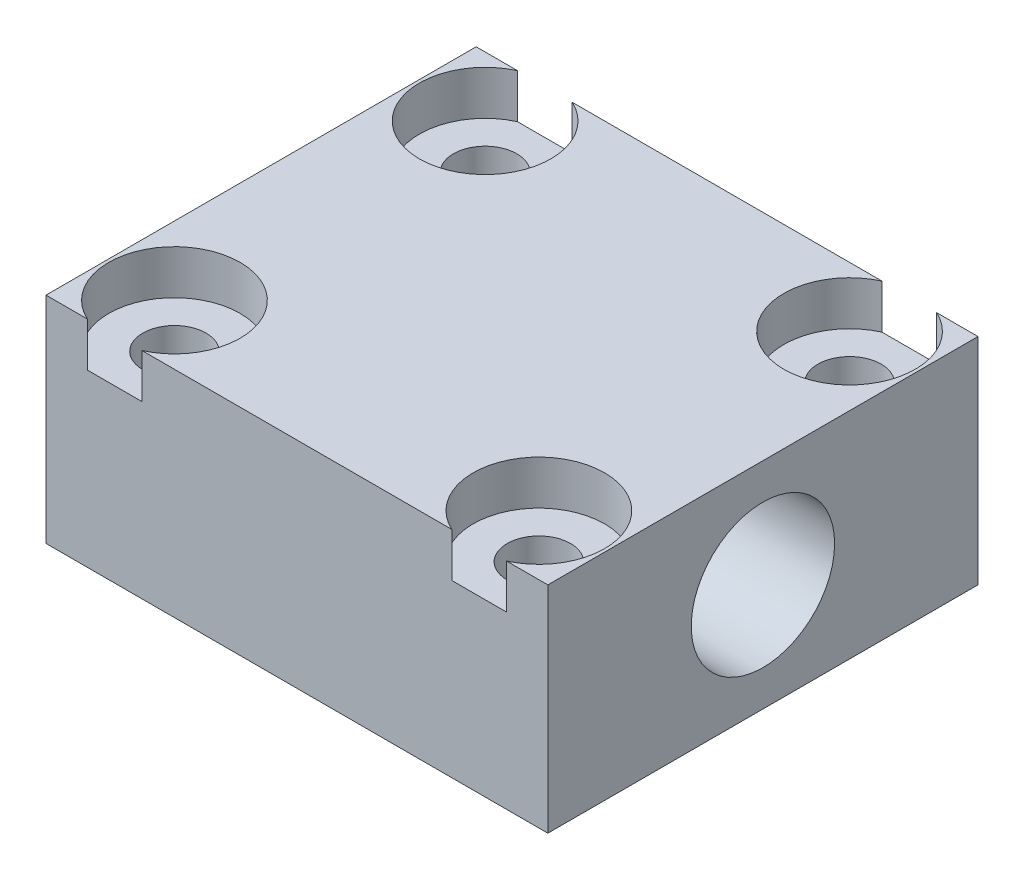
ISO-10303-21;
HEADER;
FILE_DESCRIPTION(('STEP AP214'),'2;1');
FILE_NAME('part.step','',(''),(''),'','','');
FILE_SCHEMA(('AUTOMOTIVE_DESIGN { 1 0 10303 214 1 1 1 1 }'));
ENDSEC;
DATA;
#1=APPLICATION_CONTEXT('core data for automotive mechanical design processes');
#2=APPLICATION_PROTOCOL_DEFINITION('international standard','automotive_design',2000,#1);
#3=PRODUCT_CONTEXT('',#1,'mechanical');
#4=PRODUCT('Part','Part','',(#3));
#5=PRODUCT_RELATED_PRODUCT_CATEGORY('part','',(#4));
#6=PRODUCT_DEFINITION_FORMATION('','',#4);
#7=PRODUCT_DEFINITION_CONTEXT('part definition',#1,'design');
#8=PRODUCT_DEFINITION('design','',#6,#7);
#9=PRODUCT_DEFINITION_SHAPE('','',#8);
#10=(LENGTH_UNIT() NAMED_UNIT(*) SI_UNIT(.MILLI.,.METRE.));
#11=(NAMED_UNIT(*) PLANE_ANGLE_UNIT() SI_UNIT($,.RADIAN.));
#12=(NAMED_UNIT(*) SI_UNIT($,.STERADIAN.) SOLID_ANGLE_UNIT());
#13=UNCERTAINTY_MEASURE_WITH_UNIT(LENGTH_MEASURE(1.E-05),#10,'distance_accuracy_value','');
#14=(GEOMETRIC_REPRESENTATION_CONTEXT(3) GLOBAL_UNCERTAINTY_ASSIGNED_CONTEXT((#13)) GLOBAL_UNIT_ASSIGNED_CONTEXT((#10,
#11,#12)) REPRESENTATION_CONTEXT('',''));
#15=CARTESIAN_POINT('',(0.,0.,0.));
#16=DIRECTION('',(0.,0.,1.));
#17=DIRECTION('',(1.,0.,0.));
#18=AXIS2_PLACEMENT_3D('',#15,#16,#17);
#19=CARTESIAN_POINT('',(21.,18.,-18.));
#20=DIRECTION('',(-1.,0.,0.));
#21=DIRECTION('',(0.,0.,1.));
#22=AXIS2_PLACEMENT_3D('',#19,#20,#21);
#23=PLANE('',#22);
#24=CARTESIAN_POINT('',(21.,9.,0.));
#25=DIRECTION('',(1.,0.,0.));
#26=DIRECTION('',(0.,0.,-1.));
#27=AXIS2_PLACEMENT_3D('',#24,#25,#26);
#28=CIRCLE('',#27,6.);
#29=CARTESIAN_POINT('',(21.,9.,-6.));
#30=VERTEX_POINT('',#29);
#31=EDGE_CURVE('E277',#30,#30,#28,.T.);
#32=ORIENTED_EDGE('',*,*,#31,.F.);
#33=EDGE_LOOP('',(#32));
#34=FACE_BOUND('',#33,.T.);
#35=DIRECTION('',(0.,0.,-1.));
#36=VECTOR('',#35,1.);
#37=CARTESIAN_POINT('',(21.,0.,-18.));
#38=LINE('',#37,#36);
#39=CARTESIAN_POINT('',(21.,0.,18.));
#40=VERTEX_POINT('',#39);
#41=CARTESIAN_POINT('',(21.,0.,-18.));
#42=VERTEX_POINT('',#41);
#43=EDGE_CURVE('E187',#40,#42,#38,.T.);
#44=ORIENTED_EDGE('',*,*,#43,.T.);
#45=DIRECTION('',(0.,-1.,0.));
#46=VECTOR('',#45,1.);
#47=CARTESIAN_POINT('',(21.,18.,-18.));
#48=LINE('',#47,#46);
#49=CARTESIAN_POINT('',(21.,18.,-18.));
#50=VERTEX_POINT('',#49);
#51=EDGE_CURVE('E219',#50,#42,#48,.T.);
#52=ORIENTED_EDGE('',*,*,#51,.F.);
#53=DIRECTION('',(0.,0.,-1.));
#54=VECTOR('',#53,1.);
#55=CARTESIAN_POINT('',(21.,18.,-18.));
#56=LINE('',#55,#54);
#57=CARTESIAN_POINT('',(21.,18.,18.));
#58=VERTEX_POINT('',#57);
#59=EDGE_CURVE('E188',#58,#50,#56,.T.);
#60=ORIENTED_EDGE('',*,*,#59,.F.);
#61=DIRECTION('',(0.,-1.,0.));
#62=VECTOR('',#61,1.);
#63=CARTESIAN_POINT('',(21.,18.,18.));
#64=LINE('',#63,#62);
#65=EDGE_CURVE('E203',#58,#40,#64,.T.);
#66=ORIENTED_EDGE('',*,*,#65,.T.);
#67=EDGE_LOOP('',(#44,#52,#60,#66));
#68=FACE_BOUND('',#67,.T.);
#69=ADVANCED_FACE('F33',(#34,#68),#23,.F.);
#70=CARTESIAN_POINT('',(-21.,18.,-18.));
#71=DIRECTION('',(0.,0.,1.));
#72=DIRECTION('',(1.,0.,0.));
#73=AXIS2_PLACEMENT_3D('',#70,#71,#72);
#74=PLANE('',#73);
#75=DIRECTION('',(1.,0.,0.));
#76=VECTOR('',#75,1.);
#77=CARTESIAN_POINT('',(-21.,14.3,-18.));
#78=LINE('',#77,#76);
#79=CARTESIAN_POINT('',(12.9587121525221,14.3,-18.));
#80=VERTEX_POINT('',#79);
#81=CARTESIAN_POINT('',(17.5412878474779,14.3,-18.));
#82=VERTEX_POINT('',#81);
#83=EDGE_CURVE('E230',#80,#82,#78,.T.);
#84=ORIENTED_EDGE('',*,*,#83,.T.);
#85=DIRECTION('',(0.,1.,0.));
#86=VECTOR('',#85,1.);
#87=CARTESIAN_POINT('',(17.5412878474779,18.,-18.));
#88=LINE('',#87,#86);
#89=CARTESIAN_POINT('',(17.5412878474779,18.,-18.));
#90=VERTEX_POINT('',#89);
#91=EDGE_CURVE('E169',#82,#90,#88,.T.);
#92=ORIENTED_EDGE('',*,*,#91,.T.);
#93=DIRECTION('',(-1.,0.,0.));
#94=VECTOR('',#93,1.);
#95=CARTESIAN_POINT('',(-21.,18.,-18.));
#96=LINE('',#95,#94);
#97=EDGE_CURVE('E193',#50,#90,#96,.T.);
#98=ORIENTED_EDGE('',*,*,#97,.F.);
#99=ORIENTED_EDGE('',*,*,#51,.T.);
#100=DIRECTION('',(-1.,0.,0.));
#101=VECTOR('',#100,1.);
#102=CARTESIAN_POINT('',(-21.,0.,-18.));
#103=LINE('',#102,#101);
#104=CARTESIAN_POINT('',(-21.,0.,-18.));
#105=VERTEX_POINT('',#104);
#106=EDGE_CURVE('E206',#42,#105,#103,.T.);
#107=ORIENTED_EDGE('',*,*,#106,.T.);
#108=DIRECTION('',(0.,-1.,0.));
#109=VECTOR('',#108,1.);
#110=CARTESIAN_POINT('',(-21.,18.,-18.));
#111=LINE('',#110,#109);
#112=CARTESIAN_POINT('',(-21.,18.,-18.));
#113=VERTEX_POINT('',#112);
#114=EDGE_CURVE('E216',#113,#105,#111,.T.);
#115=ORIENTED_EDGE('',*,*,#114,.F.);
#116=CARTESIAN_POINT('',(-17.5412878474779,18.,-18.));
#117=VERTEX_POINT('',#116);
#118=EDGE_CURVE('E191',#117,#113,#96,.T.);
#119=ORIENTED_EDGE('',*,*,#118,.F.);
#120=DIRECTION('',(0.,1.,0.));
#121=VECTOR('',#120,1.);
#122=CARTESIAN_POINT('',(-17.5412878474779,18.,-18.));
#123=LINE('',#122,#121);
#124=CARTESIAN_POINT('',(-17.5412878474779,14.3,-18.));
#125=VERTEX_POINT('',#124);
#126=EDGE_CURVE('E181',#117,#125,#123,.F.);
#127=ORIENTED_EDGE('',*,*,#126,.T.);
#128=DIRECTION('',(1.,0.,0.));
#129=VECTOR('',#128,1.);
#130=CARTESIAN_POINT('',(-21.,14.3,-18.));
#131=LINE('',#130,#129);
#132=CARTESIAN_POINT('',(-12.9587121525221,14.3,-18.));
#133=VERTEX_POINT('',#132);
#134=EDGE_CURVE('E225',#125,#133,#131,.T.);
#135=ORIENTED_EDGE('',*,*,#134,.T.);
#136=DIRECTION('',(0.,1.,0.));
#137=VECTOR('',#136,1.);
#138=CARTESIAN_POINT('',(-12.9587121525221,18.,-18.));
#139=LINE('',#138,#137);
#140=CARTESIAN_POINT('',(-12.9587121525221,18.,-18.));
#141=VERTEX_POINT('',#140);
#142=EDGE_CURVE('E184',#133,#141,#139,.T.);
#143=ORIENTED_EDGE('',*,*,#142,.T.);
#144=CARTESIAN_POINT('',(12.9587121525221,18.,-18.));
#145=VERTEX_POINT('',#144);
#146=EDGE_CURVE('E197',#145,#141,#96,.T.);
#147=ORIENTED_EDGE('',*,*,#146,.F.);
#148=DIRECTION('',(0.,1.,0.));
#149=VECTOR('',#148,1.);
#150=CARTESIAN_POINT('',(12.9587121525221,18.,-18.));
#151=LINE('',#150,#149);
#152=EDGE_CURVE('E166',#145,#80,#151,.F.);
#153=ORIENTED_EDGE('',*,*,#152,.T.);
#154=EDGE_LOOP('',(#84,#92,#98,#99,#107,#115,#119,#127,#135,#143,#147,#153));
#155=FACE_BOUND('',#154,.T.);
#156=ADVANCED_FACE('F248',(#155),#74,.F.);
#157=CARTESIAN_POINT('',(-21.,18.,-18.));
#158=DIRECTION('',(1.,0.,0.));
#159=DIRECTION('',(0.,0.,-1.));
#160=AXIS2_PLACEMENT_3D('',#157,#158,#159);
#161=PLANE('',#160);
#162=CARTESIAN_POINT('',(-21.,9.,0.));
#163=DIRECTION('',(1.,0.,0.));
#164=DIRECTION('',(0.,0.,-1.));
#165=AXIS2_PLACEMENT_3D('',#162,#163,#164);
#166=CIRCLE('',#165,6.);
#167=CARTESIAN_POINT('',(-21.,9.,-6.));
#168=VERTEX_POINT('',#167);
#169=EDGE_CURVE('E279',#168,#168,#166,.T.);
#170=ORIENTED_EDGE('',*,*,#169,.T.);
#171=EDGE_LOOP('',(#170));
#172=FACE_BOUND('',#171,.T.);
#173=DIRECTION('',(0.,0.,1.));
#174=VECTOR('',#173,1.);
#175=CARTESIAN_POINT('',(-21.,0.,-18.));
#176=LINE('',#175,#174);
#177=CARTESIAN_POINT('',(-21.,0.,18.));
#178=VERTEX_POINT('',#177);
#179=EDGE_CURVE('E208',#105,#178,#176,.T.);
#180=ORIENTED_EDGE('',*,*,#179,.T.);
#181=DIRECTION('',(0.,-1.,0.));
#182=VECTOR('',#181,1.);
#183=CARTESIAN_POINT('',(-21.,18.,18.));
#184=LINE('',#183,#182);
#185=CARTESIAN_POINT('',(-21.,18.,18.));
#186=VERTEX_POINT('',#185);
#187=EDGE_CURVE('E213',#186,#178,#184,.T.);
#188=ORIENTED_EDGE('',*,*,#187,.F.);
#189=DIRECTION('',(0.,0.,1.));
#190=VECTOR('',#189,1.);
#191=CARTESIAN_POINT('',(-21.,18.,-18.));
#192=LINE('',#191,#190);
#193=EDGE_CURVE('E196',#113,#186,#192,.T.);
#194=ORIENTED_EDGE('',*,*,#193,.F.);
#195=ORIENTED_EDGE('',*,*,#114,.T.);
#196=EDGE_LOOP('',(#180,#188,#194,#195));
#197=FACE_BOUND('',#196,.T.);
#198=ADVANCED_FACE('F274',(#172,#197),#161,.F.);
#199=CARTESIAN_POINT('',(-21.,18.,18.));
#200=DIRECTION('',(0.,0.,-1.));
#201=DIRECTION('',(-1.,0.,0.));
#202=AXIS2_PLACEMENT_3D('',#199,#200,#201);
#203=PLANE('',#202);
#204=DIRECTION('',(-1.,0.,0.));
#205=VECTOR('',#204,1.);
#206=CARTESIAN_POINT('',(-21.,14.3,18.));
#207=LINE('',#206,#205);
#208=CARTESIAN_POINT('',(-12.9587121525221,14.3,18.));
#209=VERTEX_POINT('',#208);
#210=CARTESIAN_POINT('',(-17.5412878474779,14.3,18.));
#211=VERTEX_POINT('',#210);
#212=EDGE_CURVE('E11',#209,#211,#207,.T.);
#213=ORIENTED_EDGE('',*,*,#212,.T.);
#214=DIRECTION('',(0.,1.,0.));
#215=VECTOR('',#214,1.);
#216=CARTESIAN_POINT('',(-17.5412878474779,18.,18.));
#217=LINE('',#216,#215);
#218=CARTESIAN_POINT('',(-17.5412878474779,18.,18.));
#219=VERTEX_POINT('',#218);
#220=EDGE_CURVE('E128',#211,#219,#217,.T.);
#221=ORIENTED_EDGE('',*,*,#220,.T.);
#222=DIRECTION('',(1.,0.,0.));
#223=VECTOR('',#222,1.);
#224=CARTESIAN_POINT('',(-21.,18.,18.));
#225=LINE('',#224,#223);
#226=EDGE_CURVE('E200',#186,#219,#225,.T.);
#227=ORIENTED_EDGE('',*,*,#226,.F.);
#228=ORIENTED_EDGE('',*,*,#187,.T.);
#229=DIRECTION('',(1.,0.,0.));
#230=VECTOR('',#229,1.);
#231=CARTESIAN_POINT('',(-21.,0.,18.));
#232=LINE('',#231,#230);
#233=EDGE_CURVE('E192',#178,#40,#232,.T.);
#234=ORIENTED_EDGE('',*,*,#233,.T.);
#235=ORIENTED_EDGE('',*,*,#65,.F.);
#236=CARTESIAN_POINT('',(17.5412878474779,18.,18.));
#237=VERTEX_POINT('',#236);
#238=EDGE_CURVE('E199',#237,#58,#225,.T.);
#239=ORIENTED_EDGE('',*,*,#238,.F.);
#240=DIRECTION('',(0.,1.,0.));
#241=VECTOR('',#240,1.);
#242=CARTESIAN_POINT('',(17.5412878474779,18.,18.));
#243=LINE('',#242,#241);
#244=CARTESIAN_POINT('',(17.5412878474779,14.3,18.));
#245=VERTEX_POINT('',#244);
#246=EDGE_CURVE('E55',#237,#245,#243,.F.);
#247=ORIENTED_EDGE('',*,*,#246,.T.);
#248=DIRECTION('',(-1.,0.,0.));
#249=VECTOR('',#248,1.);
#250=CARTESIAN_POINT('',(-21.,14.3,18.));
#251=LINE('',#250,#249);
#252=CARTESIAN_POINT('',(12.9587121525221,14.3,18.));
#253=VERTEX_POINT('',#252);
#254=EDGE_CURVE('E40',#245,#253,#251,.T.);
#255=ORIENTED_EDGE('',*,*,#254,.T.);
#256=DIRECTION('',(0.,1.,0.));
#257=VECTOR('',#256,1.);
#258=CARTESIAN_POINT('',(12.9587121525221,18.,18.));
#259=LINE('',#258,#257);
#260=CARTESIAN_POINT('',(12.9587121525221,18.,18.));
#261=VERTEX_POINT('',#260);
#262=EDGE_CURVE('E155',#253,#261,#259,.T.);
#263=ORIENTED_EDGE('',*,*,#262,.T.);
#264=CARTESIAN_POINT('',(-12.9587121525221,18.,18.));
#265=VERTEX_POINT('',#264);
#266=EDGE_CURVE('E135',#265,#261,#225,.T.);
#267=ORIENTED_EDGE('',*,*,#266,.F.);
#268=DIRECTION('',(0.,1.,0.));
#269=VECTOR('',#268,1.);
#270=CARTESIAN_POINT('',(-12.9587121525221,18.,18.));
#271=LINE('',#270,#269);
#272=EDGE_CURVE('E47',#265,#209,#271,.F.);
#273=ORIENTED_EDGE('',*,*,#272,.T.);
#274=EDGE_LOOP('',(#213,#221,#227,#228,#234,#235,#239,#247,#255,#263,#267,#273));
#275=FACE_BOUND('',#274,.T.);
#276=ADVANCED_FACE('F133',(#275),#203,.F.);
#277=CARTESIAN_POINT('',(0.,18.,0.));
#278=DIRECTION('',(0.,1.,0.));
#279=DIRECTION('',(0.,0.,1.));
#280=AXIS2_PLACEMENT_3D('',#277,#278,#279);
#281=PLANE('',#280);
#282=CARTESIAN_POINT('',(-15.25,18.,13.));
#283=DIRECTION('',(0.,1.,0.));
#284=DIRECTION('',(0.,0.,1.));
#285=AXIS2_PLACEMENT_3D('',#282,#283,#284);
#286=CIRCLE('',#285,5.49999999999999);
#287=EDGE_CURVE('E130',#265,#219,#286,.T.);
#288=ORIENTED_EDGE('',*,*,#287,.F.);
#289=ORIENTED_EDGE('',*,*,#266,.T.);
#290=CARTESIAN_POINT('',(15.25,18.,13.));
#291=DIRECTION('',(0.,1.,0.));
#292=DIRECTION('',(0.,0.,1.));
#293=AXIS2_PLACEMENT_3D('',#290,#291,#292);
#294=CIRCLE('',#293,5.49999999999999);
#295=EDGE_CURVE('E138',#237,#261,#294,.T.);
#296=ORIENTED_EDGE('',*,*,#295,.F.);
#297=ORIENTED_EDGE('',*,*,#238,.T.);
#298=ORIENTED_EDGE('',*,*,#59,.T.);
#299=ORIENTED_EDGE('',*,*,#97,.T.);
#300=CARTESIAN_POINT('',(15.25,18.,-13.));
#301=DIRECTION('',(0.,1.,0.));
#302=DIRECTION('',(0.,0.,1.));
#303=AXIS2_PLACEMENT_3D('',#300,#301,#302);
#304=CIRCLE('',#303,5.49999999999999);
#305=EDGE_CURVE('E228',#145,#90,#304,.T.);
#306=ORIENTED_EDGE('',*,*,#305,.F.);
#307=ORIENTED_EDGE('',*,*,#146,.T.);
#308=CARTESIAN_POINT('',(-15.25,18.,-13.));
#309=DIRECTION('',(0.,1.,0.));
#310=DIRECTION('',(0.,0.,1.));
#311=AXIS2_PLACEMENT_3D('',#308,#309,#310);
#312=CIRCLE('',#311,5.49999999999999);
#313=EDGE_CURVE('E222',#117,#141,#312,.T.);
#314=ORIENTED_EDGE('',*,*,#313,.F.);
#315=ORIENTED_EDGE('',*,*,#118,.T.);
#316=ORIENTED_EDGE('',*,*,#193,.T.);
#317=ORIENTED_EDGE('',*,*,#226,.T.);
#318=EDGE_LOOP('',(#288,#289,#296,#297,#298,#299,#306,#307,#314,#315,#316,#317));
#319=FACE_BOUND('',#318,.T.);
#320=ADVANCED_FACE('F238',(#319),#281,.T.);
#321=CARTESIAN_POINT('',(0.,0.,0.));
#322=DIRECTION('',(0.,1.,0.));
#323=DIRECTION('',(0.,0.,1.));
#324=AXIS2_PLACEMENT_3D('',#321,#322,#323);
#325=PLANE('',#324);
#326=CARTESIAN_POINT('',(-15.25,0.,13.));
#327=DIRECTION('',(0.,1.,0.));
#328=DIRECTION('',(0.,0.,1.));
#329=AXIS2_PLACEMENT_3D('',#326,#327,#328);
#330=CIRCLE('',#329,2.65);
#331=CARTESIAN_POINT('',(-15.25,0.,15.65));
#332=VERTEX_POINT('',#331);
#333=EDGE_CURVE('E136',#332,#332,#330,.T.);
#334=ORIENTED_EDGE('',*,*,#333,.T.);
#335=EDGE_LOOP('',(#334));
#336=FACE_BOUND('',#335,.T.);
#337=CARTESIAN_POINT('',(15.25,0.,13.));
#338=DIRECTION('',(0.,1.,0.));
#339=DIRECTION('',(0.,0.,1.));
#340=AXIS2_PLACEMENT_3D('',#337,#338,#339);
#341=CIRCLE('',#340,2.65);
#342=CARTESIAN_POINT('',(15.25,0.,15.65));
#343=VERTEX_POINT('',#342);
#344=EDGE_CURVE('E151',#343,#343,#341,.T.);
#345=ORIENTED_EDGE('',*,*,#344,.T.);
#346=EDGE_LOOP('',(#345));
#347=FACE_BOUND('',#346,.T.);
#348=CARTESIAN_POINT('',(15.25,0.,-13.));
#349=DIRECTION('',(0.,1.,0.));
#350=DIRECTION('',(0.,0.,1.));
#351=AXIS2_PLACEMENT_3D('',#348,#349,#350);
#352=CIRCLE('',#351,2.65);
#353=CARTESIAN_POINT('',(15.25,0.,-10.35));
#354=VERTEX_POINT('',#353);
#355=EDGE_CURVE('E163',#354,#354,#352,.T.);
#356=ORIENTED_EDGE('',*,*,#355,.T.);
#357=EDGE_LOOP('',(#356));
#358=FACE_BOUND('',#357,.T.);
#359=CARTESIAN_POINT('',(-15.25,0.,-13.));
#360=DIRECTION('',(0.,1.,0.));
#361=DIRECTION('',(0.,0.,1.));
#362=AXIS2_PLACEMENT_3D('',#359,#360,#361);
#363=CIRCLE('',#362,2.65);
#364=CARTESIAN_POINT('',(-15.25,0.,-10.35));
#365=VERTEX_POINT('',#364);
#366=EDGE_CURVE('E178',#365,#365,#363,.T.);
#367=ORIENTED_EDGE('',*,*,#366,.T.);
#368=EDGE_LOOP('',(#367));
#369=FACE_BOUND('',#368,.T.);
#370=ORIENTED_EDGE('',*,*,#43,.F.);
#371=ORIENTED_EDGE('',*,*,#233,.F.);
#372=ORIENTED_EDGE('',*,*,#179,.F.);
#373=ORIENTED_EDGE('',*,*,#106,.F.);
#374=EDGE_LOOP('',(#370,#371,#372,#373));
#375=FACE_BOUND('',#374,.T.);
#376=ADVANCED_FACE('F325',(#336,#347,#358,#369,#375),#325,.F.);
#377=CARTESIAN_POINT('',(-12.6,14.3,-13.));
#378=DIRECTION('',(0.,-1.,0.));
#379=DIRECTION('',(0.,0.,-1.));
#380=AXIS2_PLACEMENT_3D('',#377,#378,#379);
#381=PLANE('',#380);
#382=CARTESIAN_POINT('',(-15.25,14.3,-13.));
#383=DIRECTION('',(0.,1.,0.));
#384=DIRECTION('',(0.,0.,1.));
#385=AXIS2_PLACEMENT_3D('',#382,#383,#384);
#386=CIRCLE('',#385,2.65000000000001);
#387=CARTESIAN_POINT('',(-15.25,14.3,-10.35));
#388=VERTEX_POINT('',#387);
#389=EDGE_CURVE('E175',#388,#388,#386,.T.);
#390=ORIENTED_EDGE('',*,*,#389,.F.);
#391=EDGE_LOOP('',(#390));
#392=FACE_BOUND('',#391,.T.);
#393=CARTESIAN_POINT('',(-15.25,14.3,-13.));
#394=DIRECTION('',(0.,1.,0.));
#395=DIRECTION('',(0.,0.,1.));
#396=AXIS2_PLACEMENT_3D('',#393,#394,#395);
#397=CIRCLE('',#396,5.49999999999999);
#398=EDGE_CURVE('E172',#125,#133,#397,.T.);
#399=ORIENTED_EDGE('',*,*,#398,.T.);
#400=ORIENTED_EDGE('',*,*,#134,.F.);
#401=EDGE_LOOP('',(#399,#400));
#402=FACE_BOUND('',#401,.T.);
#403=ADVANCED_FACE('F322',(#392,#402),#381,.F.);
#404=CARTESIAN_POINT('',(-15.25,18.,-13.));
#405=DIRECTION('',(0.,1.,0.));
#406=DIRECTION('',(0.,0.,1.));
#407=AXIS2_PLACEMENT_3D('',#404,#405,#406);
#408=CYLINDRICAL_SURFACE('',#407,5.49999999999999);
#409=ORIENTED_EDGE('',*,*,#398,.F.);
#410=ORIENTED_EDGE('',*,*,#126,.F.);
#411=ORIENTED_EDGE('',*,*,#313,.T.);
#412=ORIENTED_EDGE('',*,*,#142,.F.);
#413=EDGE_LOOP('',(#409,#410,#411,#412));
#414=FACE_BOUND('',#413,.T.);
#415=ADVANCED_FACE('F264',(#414),#408,.F.);
#416=CARTESIAN_POINT('',(-15.25,18.,-13.));
#417=DIRECTION('',(0.,1.,0.));
#418=DIRECTION('',(0.,0.,1.));
#419=AXIS2_PLACEMENT_3D('',#416,#417,#418);
#420=CYLINDRICAL_SURFACE('',#419,2.65);
#421=ORIENTED_EDGE('',*,*,#366,.F.);
#422=EDGE_LOOP('',(#421));
#423=FACE_BOUND('',#422,.T.);
#424=ORIENTED_EDGE('',*,*,#389,.T.);
#425=EDGE_LOOP('',(#424));
#426=FACE_BOUND('',#425,.T.);
#427=ADVANCED_FACE('F255',(#423,#426),#420,.F.);
#428=CARTESIAN_POINT('',(17.9,14.3,-13.));
#429=DIRECTION('',(0.,-1.,0.));
#430=DIRECTION('',(0.,0.,-1.));
#431=AXIS2_PLACEMENT_3D('',#428,#429,#430);
#432=PLANE('',#431);
#433=CARTESIAN_POINT('',(15.25,14.3,-13.));
#434=DIRECTION('',(0.,1.,0.));
#435=DIRECTION('',(0.,0.,1.));
#436=AXIS2_PLACEMENT_3D('',#433,#434,#435);
#437=CIRCLE('',#436,2.65000000000001);
#438=CARTESIAN_POINT('',(15.25,14.3,-10.35));
#439=VERTEX_POINT('',#438);
#440=EDGE_CURVE('E160',#439,#439,#437,.T.);
#441=ORIENTED_EDGE('',*,*,#440,.F.);
#442=EDGE_LOOP('',(#441));
#443=FACE_BOUND('',#442,.T.);
#444=CARTESIAN_POINT('',(15.25,14.3,-13.));
#445=DIRECTION('',(0.,1.,0.));
#446=DIRECTION('',(0.,0.,1.));
#447=AXIS2_PLACEMENT_3D('',#444,#445,#446);
#448=CIRCLE('',#447,5.49999999999999);
#449=EDGE_CURVE('E157',#80,#82,#448,.T.);
#450=ORIENTED_EDGE('',*,*,#449,.T.);
#451=ORIENTED_EDGE('',*,*,#83,.F.);
#452=EDGE_LOOP('',(#450,#451));
#453=FACE_BOUND('',#452,.T.);
#454=ADVANCED_FACE('F253',(#443,#453),#432,.F.);
#455=CARTESIAN_POINT('',(15.25,18.,-13.));
#456=DIRECTION('',(0.,1.,0.));
#457=DIRECTION('',(0.,0.,1.));
#458=AXIS2_PLACEMENT_3D('',#455,#456,#457);
#459=CYLINDRICAL_SURFACE('',#458,5.49999999999999);
#460=ORIENTED_EDGE('',*,*,#449,.F.);
#461=ORIENTED_EDGE('',*,*,#152,.F.);
#462=ORIENTED_EDGE('',*,*,#305,.T.);
#463=ORIENTED_EDGE('',*,*,#91,.F.);
#464=EDGE_LOOP('',(#460,#461,#462,#463));
#465=FACE_BOUND('',#464,.T.);
#466=ADVANCED_FACE('F251',(#465),#459,.F.);
#467=CARTESIAN_POINT('',(15.25,18.,-13.));
#468=DIRECTION('',(0.,1.,0.));
#469=DIRECTION('',(0.,0.,1.));
#470=AXIS2_PLACEMENT_3D('',#467,#468,#469);
#471=CYLINDRICAL_SURFACE('',#470,2.65);
#472=ORIENTED_EDGE('',*,*,#355,.F.);
#473=EDGE_LOOP('',(#472));
#474=FACE_BOUND('',#473,.T.);
#475=ORIENTED_EDGE('',*,*,#440,.T.);
#476=EDGE_LOOP('',(#475));
#477=FACE_BOUND('',#476,.T.);
#478=ADVANCED_FACE('F262',(#474,#477),#471,.F.);
#479=CARTESIAN_POINT('',(17.9,14.3,13.));
#480=DIRECTION('',(0.,-1.,0.));
#481=DIRECTION('',(0.,0.,-1.));
#482=AXIS2_PLACEMENT_3D('',#479,#480,#481);
#483=PLANE('',#482);
#484=CARTESIAN_POINT('',(15.25,14.3,13.));
#485=DIRECTION('',(0.,1.,0.));
#486=DIRECTION('',(0.,0.,1.));
#487=AXIS2_PLACEMENT_3D('',#484,#485,#486);
#488=CIRCLE('',#487,2.65000000000001);
#489=CARTESIAN_POINT('',(15.25,14.3,15.65));
#490=VERTEX_POINT('',#489);
#491=EDGE_CURVE('E148',#490,#490,#488,.T.);
#492=ORIENTED_EDGE('',*,*,#491,.F.);
#493=EDGE_LOOP('',(#492));
#494=FACE_BOUND('',#493,.T.);
#495=CARTESIAN_POINT('',(15.25,14.3,13.));
#496=DIRECTION('',(0.,1.,0.));
#497=DIRECTION('',(0.,0.,1.));
#498=AXIS2_PLACEMENT_3D('',#495,#496,#497);
#499=CIRCLE('',#498,5.49999999999999);
#500=EDGE_CURVE('E145',#245,#253,#499,.T.);
#501=ORIENTED_EDGE('',*,*,#500,.T.);
#502=ORIENTED_EDGE('',*,*,#254,.F.);
#503=EDGE_LOOP('',(#501,#502));
#504=FACE_BOUND('',#503,.T.);
#505=ADVANCED_FACE('F235',(#494,#504),#483,.F.);
#506=CARTESIAN_POINT('',(15.25,18.,13.));
#507=DIRECTION('',(0.,1.,0.));
#508=DIRECTION('',(0.,0.,1.));
#509=AXIS2_PLACEMENT_3D('',#506,#507,#508);
#510=CYLINDRICAL_SURFACE('',#509,5.49999999999999);
#511=ORIENTED_EDGE('',*,*,#500,.F.);
#512=ORIENTED_EDGE('',*,*,#246,.F.);
#513=ORIENTED_EDGE('',*,*,#295,.T.);
#514=ORIENTED_EDGE('',*,*,#262,.F.);
#515=EDGE_LOOP('',(#511,#512,#513,#514));
#516=FACE_BOUND('',#515,.T.);
#517=ADVANCED_FACE('F236',(#516),#510,.F.);
#518=CARTESIAN_POINT('',(15.25,18.,13.));
#519=DIRECTION('',(0.,1.,0.));
#520=DIRECTION('',(0.,0.,1.));
#521=AXIS2_PLACEMENT_3D('',#518,#519,#520);
#522=CYLINDRICAL_SURFACE('',#521,2.65);
#523=ORIENTED_EDGE('',*,*,#344,.F.);
#524=EDGE_LOOP('',(#523));
#525=FACE_BOUND('',#524,.T.);
#526=ORIENTED_EDGE('',*,*,#491,.T.);
#527=EDGE_LOOP('',(#526));
#528=FACE_BOUND('',#527,.T.);
#529=ADVANCED_FACE('F290',(#525,#528),#522,.F.);
#530=CARTESIAN_POINT('',(-12.6,14.3,13.));
#531=DIRECTION('',(0.,-1.,0.));
#532=DIRECTION('',(0.,0.,-1.));
#533=AXIS2_PLACEMENT_3D('',#530,#531,#532);
#534=PLANE('',#533);
#535=CARTESIAN_POINT('',(-15.25,14.3,13.));
#536=DIRECTION('',(0.,1.,0.));
#537=DIRECTION('',(0.,0.,1.));
#538=AXIS2_PLACEMENT_3D('',#535,#536,#537);
#539=CIRCLE('',#538,2.65000000000001);
#540=CARTESIAN_POINT('',(-15.25,14.3,15.65));
#541=VERTEX_POINT('',#540);
#542=EDGE_CURVE('E129',#541,#541,#539,.T.);
#543=ORIENTED_EDGE('',*,*,#542,.F.);
#544=EDGE_LOOP('',(#543));
#545=FACE_BOUND('',#544,.T.);
#546=CARTESIAN_POINT('',(-15.25,14.3,13.));
#547=DIRECTION('',(0.,1.,0.));
#548=DIRECTION('',(0.,0.,1.));
#549=AXIS2_PLACEMENT_3D('',#546,#547,#548);
#550=CIRCLE('',#549,5.49999999999999);
#551=EDGE_CURVE('E124',#209,#211,#550,.T.);
#552=ORIENTED_EDGE('',*,*,#551,.T.);
#553=ORIENTED_EDGE('',*,*,#212,.F.);
#554=EDGE_LOOP('',(#552,#553));
#555=FACE_BOUND('',#554,.T.);
#556=ADVANCED_FACE('F123',(#545,#555),#534,.F.);
#557=CARTESIAN_POINT('',(-15.25,18.,13.));
#558=DIRECTION('',(0.,1.,0.));
#559=DIRECTION('',(0.,0.,1.));
#560=AXIS2_PLACEMENT_3D('',#557,#558,#559);
#561=CYLINDRICAL_SURFACE('',#560,5.49999999999999);
#562=ORIENTED_EDGE('',*,*,#551,.F.);
#563=ORIENTED_EDGE('',*,*,#272,.F.);
#564=ORIENTED_EDGE('',*,*,#287,.T.);
#565=ORIENTED_EDGE('',*,*,#220,.F.);
#566=EDGE_LOOP('',(#562,#563,#564,#565));
#567=FACE_BOUND('',#566,.T.);
#568=ADVANCED_FACE('F127',(#567),#561,.F.);
#569=CARTESIAN_POINT('',(-15.25,18.,13.));
#570=DIRECTION('',(0.,1.,0.));
#571=DIRECTION('',(0.,0.,1.));
#572=AXIS2_PLACEMENT_3D('',#569,#570,#571);
#573=CYLINDRICAL_SURFACE('',#572,2.65);
#574=ORIENTED_EDGE('',*,*,#333,.F.);
#575=EDGE_LOOP('',(#574));
#576=FACE_BOUND('',#575,.T.);
#577=ORIENTED_EDGE('',*,*,#542,.T.);
#578=EDGE_LOOP('',(#577));
#579=FACE_BOUND('',#578,.T.);
#580=ADVANCED_FACE('F287',(#576,#579),#573,.F.);
#581=CARTESIAN_POINT('',(-21.,9.,0.));
#582=DIRECTION('',(1.,0.,0.));
#583=DIRECTION('',(0.,0.,-1.));
#584=AXIS2_PLACEMENT_3D('',#581,#582,#583);
#585=CYLINDRICAL_SURFACE('',#584,6.);
#586=CARTESIAN_POINT('',(-21.,9.,-6.));
#587=CARTESIAN_POINT('',(-20.5625,9.,-6.));
#588=CARTESIAN_POINT('',(-20.125,9.,-6.));
#589=CARTESIAN_POINT('',(-19.25,9.,-6.));
#590=CARTESIAN_POINT('',(-18.8125,9.,-6.));
#591=CARTESIAN_POINT('',(-17.9375,9.,-6.));
#592=CARTESIAN_POINT('',(-17.5,9.,-6.));
#593=CARTESIAN_POINT('',(-16.625,9.,-6.));
#594=CARTESIAN_POINT('',(-16.1875,9.,-6.));
#595=CARTESIAN_POINT('',(-15.3125,9.,-6.));
#596=CARTESIAN_POINT('',(-14.875,9.,-6.));
#597=CARTESIAN_POINT('',(-14.,9.,-6.));
#598=CARTESIAN_POINT('',(-13.5625,9.,-6.));
#599=CARTESIAN_POINT('',(-12.6875,9.,-6.));
#600=CARTESIAN_POINT('',(-12.25,9.,-6.));
#601=CARTESIAN_POINT('',(-11.375,9.,-6.));
#602=CARTESIAN_POINT('',(-10.9375,9.,-6.));
#603=CARTESIAN_POINT('',(-10.0625,9.,-6.));
#604=CARTESIAN_POINT('',(-9.62500000000001,9.,-6.));
#605=CARTESIAN_POINT('',(-8.75000000000001,9.,-6.));
#606=CARTESIAN_POINT('',(-8.31250000000001,9.,-6.));
#607=CARTESIAN_POINT('',(-7.43750000000001,9.,-6.));
#608=CARTESIAN_POINT('',(-7.00000000000001,9.,-6.));
#609=CARTESIAN_POINT('',(-6.12500000000001,9.,-6.));
#610=CARTESIAN_POINT('',(-5.68750000000001,9.,-6.));
#611=CARTESIAN_POINT('',(-4.81250000000001,9.,-6.));
#612=CARTESIAN_POINT('',(-4.37500000000001,9.,-6.));
#613=CARTESIAN_POINT('',(-3.50000000000001,9.,-6.));
#614=CARTESIAN_POINT('',(-3.06250000000001,9.,-6.));
#615=CARTESIAN_POINT('',(-2.18750000000001,9.,-6.));
#616=CARTESIAN_POINT('',(-1.75000000000001,9.,-6.));
#617=CARTESIAN_POINT('',(-0.875000000000011,9.,-6.));
#618=CARTESIAN_POINT('',(-0.437500000000011,9.,-6.));
#619=CARTESIAN_POINT('',(0.43749999999999,9.,-6.));
#620=CARTESIAN_POINT('',(0.87499999999999,9.,-6.));
#621=CARTESIAN_POINT('',(1.74999999999999,9.,-6.));
#622=CARTESIAN_POINT('',(2.18749999999999,9.,-6.));
#623=CARTESIAN_POINT('',(3.06249999999999,9.,-6.));
#624=CARTESIAN_POINT('',(3.49999999999999,9.,-6.));
#625=CARTESIAN_POINT('',(4.37499999999999,9.,-6.));
#626=CARTESIAN_POINT('',(4.81249999999999,9.,-6.));
#627=CARTESIAN_POINT('',(5.68749999999999,9.,-6.));
#628=CARTESIAN_POINT('',(6.12499999999999,9.,-6.));
#629=CARTESIAN_POINT('',(6.99999999999999,9.,-6.));
#630=CARTESIAN_POINT('',(7.43749999999999,9.,-6.));
#631=CARTESIAN_POINT('',(8.31249999999999,9.,-6.));
#632=CARTESIAN_POINT('',(8.74999999999999,9.,-6.));
#633=CARTESIAN_POINT('',(9.62499999999999,9.,-6.));
#634=CARTESIAN_POINT('',(10.0625,9.,-6.));
#635=CARTESIAN_POINT('',(10.9375,9.,-6.));
#636=CARTESIAN_POINT('',(11.375,9.,-6.));
#637=CARTESIAN_POINT('',(12.25,9.,-6.));
#638=CARTESIAN_POINT('',(12.6875,9.,-6.));
#639=CARTESIAN_POINT('',(13.5625,9.,-6.));
#640=CARTESIAN_POINT('',(14.,9.,-6.));
#641=CARTESIAN_POINT('',(14.875,9.,-6.));
#642=CARTESIAN_POINT('',(15.3125,9.,-6.));
#643=CARTESIAN_POINT('',(16.1875,9.,-6.));
#644=CARTESIAN_POINT('',(16.625,9.,-6.));
#645=CARTESIAN_POINT('',(17.5,9.,-6.));
#646=CARTESIAN_POINT('',(17.9375,9.,-6.));
#647=CARTESIAN_POINT('',(18.8125,9.,-6.));
#648=CARTESIAN_POINT('',(19.25,9.,-6.));
#649=CARTESIAN_POINT('',(20.125,9.,-6.));
#650=CARTESIAN_POINT('',(20.5625,9.,-6.));
#651=CARTESIAN_POINT('',(21.,9.,-6.));
#652=B_SPLINE_CURVE_WITH_KNOTS('',3,(#586,#587,#588,#589,#590,#591,#592,#593,#594,#595,#596,
#597,#598,#599,#600,#601,#602,#603,#604,#605,#606,#607,#608,#609,#610,#611,#612,#613,#614,#615,
#616,#617,#618,#619,#620,#621,#622,#623,#624,#625,#626,#627,#628,#629,#630,#631,#632,#633,#634,
#635,#636,#637,#638,#639,#640,#641,#642,#643,#644,#645,#646,#647,#648,#649,#650,#651),
.UNSPECIFIED.,.F.,.F.,(4,2,2,2,2,2,2,2,2,2,2,2,2,2,2,2,2,2,2,2,2,2,2,2,2,2,2,2,2,2,2,2,4),(0.,
1.3125,2.625,3.9375,5.25,6.5625,7.875,9.1875,10.5,11.8125,13.125,14.4375,15.75,17.0625,18.375,
19.6875,21.,22.3125,23.625,24.9375,26.25,27.5625,28.875,30.1875,31.5,32.8125,34.125,35.4375,
36.75,38.0625,39.375,40.6875,42.),.UNSPECIFIED.);
#653=EDGE_CURVE('BSEAM303',#168,#30,#652,.T.);
#654=ORIENTED_EDGE('',*,*,#169,.F.);
#655=ORIENTED_EDGE('',*,*,#31,.T.);
#656=ORIENTED_EDGE('',*,*,#653,.T.);
#657=ORIENTED_EDGE('',*,*,#653,.F.);
#658=EDGE_LOOP('',(#654,#656,#655,#657));
#659=FACE_BOUND('',#658,.T.);
#660=ADVANCED_FACE('F303',(#659),#585,.F.);
#661=CLOSED_SHELL('',(#69,#156,#198,#276,#320,#376,#403,#415,#427,#454,#466,#478,#505,#517,#529,
#556,#568,#580,#660));
#662=MANIFOLD_SOLID_BREP('B2',#661);
#663=ADVANCED_BREP_SHAPE_REPRESENTATION('',(#18,#662),#14);
#664=SHAPE_DEFINITION_REPRESENTATION(#9,#663);
ENDSEC;
END-ISO-10303-21;
